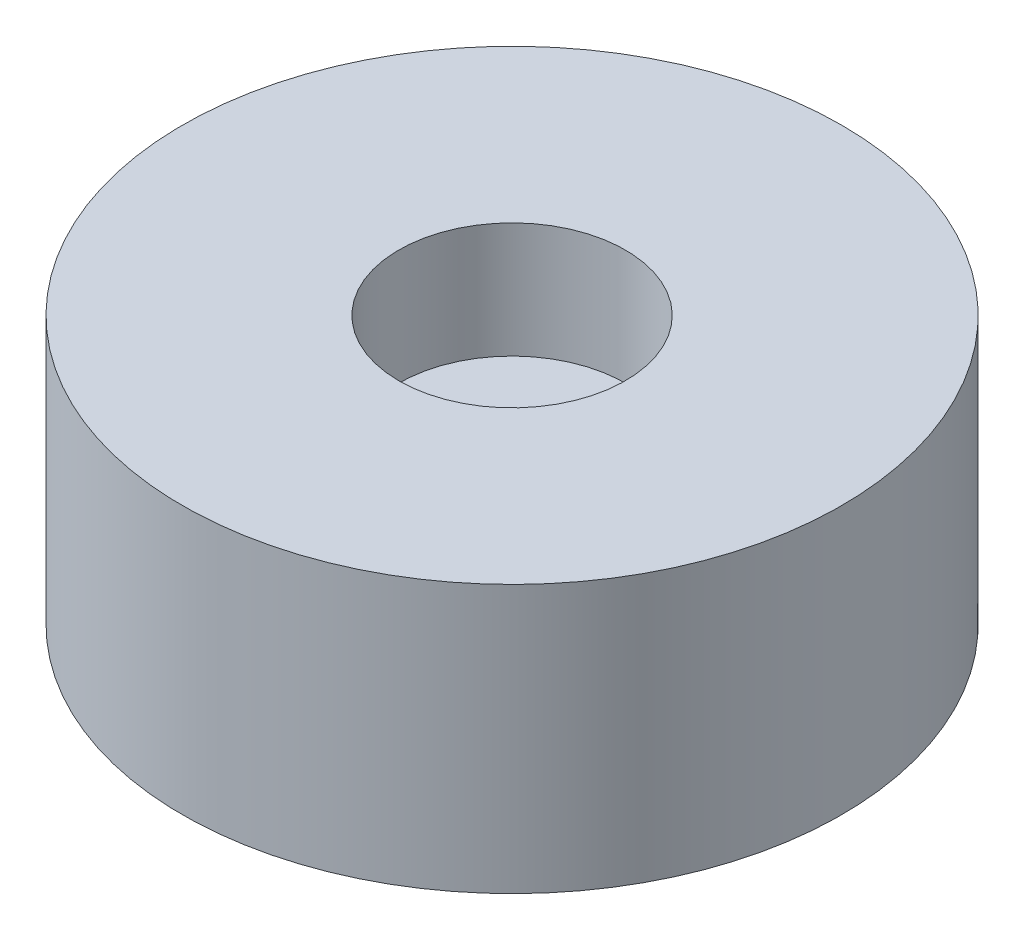
ISO-10303-21;
HEADER;
FILE_DESCRIPTION(('STEP AP214'),'2;1');
FILE_NAME('part.step','',(''),(''),'','','');
FILE_SCHEMA(('AUTOMOTIVE_DESIGN { 1 0 10303 214 1 1 1 1 }'));
ENDSEC;
DATA;
#1=APPLICATION_CONTEXT('core data for automotive mechanical design processes');
#2=APPLICATION_PROTOCOL_DEFINITION('international standard','automotive_design',2000,#1);
#3=PRODUCT_CONTEXT('',#1,'mechanical');
#4=PRODUCT('Part','Part','',(#3));
#5=PRODUCT_RELATED_PRODUCT_CATEGORY('part','',(#4));
#6=PRODUCT_DEFINITION_FORMATION('','',#4);
#7=PRODUCT_DEFINITION_CONTEXT('part definition',#1,'design');
#8=PRODUCT_DEFINITION('design','',#6,#7);
#9=PRODUCT_DEFINITION_SHAPE('','',#8);
#10=(LENGTH_UNIT() NAMED_UNIT(*) SI_UNIT(.MILLI.,.METRE.));
#11=(NAMED_UNIT(*) PLANE_ANGLE_UNIT() SI_UNIT($,.RADIAN.));
#12=(NAMED_UNIT(*) SI_UNIT($,.STERADIAN.) SOLID_ANGLE_UNIT());
#13=UNCERTAINTY_MEASURE_WITH_UNIT(LENGTH_MEASURE(1.E-05),#10,'distance_accuracy_value','');
#14=(GEOMETRIC_REPRESENTATION_CONTEXT(3) GLOBAL_UNCERTAINTY_ASSIGNED_CONTEXT((#13)) GLOBAL_UNIT_ASSIGNED_CONTEXT((#10,
#11,#12)) REPRESENTATION_CONTEXT('',''));
#15=CARTESIAN_POINT('',(0.,0.,0.));
#16=DIRECTION('',(0.,0.,1.));
#17=DIRECTION('',(1.,0.,0.));
#18=AXIS2_PLACEMENT_3D('',#15,#16,#17);
#19=CARTESIAN_POINT('',(0.,6.5,0.));
#20=DIRECTION('',(0.,-1.,0.));
#21=DIRECTION('',(0.,0.,-1.));
#22=AXIS2_PLACEMENT_3D('',#19,#20,#21);
#23=CYLINDRICAL_SURFACE('',#22,8.);
#24=CARTESIAN_POINT('',(0.,6.5,0.));
#25=DIRECTION('',(0.,1.,0.));
#26=DIRECTION('',(0.,0.,1.));
#27=AXIS2_PLACEMENT_3D('',#24,#25,#26);
#28=CIRCLE('',#27,8.);
#29=CARTESIAN_POINT('',(0.,6.5,-8.));
#30=VERTEX_POINT('',#29);
#31=EDGE_CURVE('E41',#30,#30,#28,.T.);
#32=CARTESIAN_POINT('',(0.,0.,0.));
#33=DIRECTION('',(0.,1.,0.));
#34=DIRECTION('',(0.,0.,1.));
#35=AXIS2_PLACEMENT_3D('',#32,#33,#34);
#36=CIRCLE('',#35,8.);
#37=CARTESIAN_POINT('',(0.,0.,-8.));
#38=VERTEX_POINT('',#37);
#39=EDGE_CURVE('E37',#38,#38,#36,.T.);
#40=CARTESIAN_POINT('',(0.,6.5,-8.));
#41=CARTESIAN_POINT('',(0.,6.43229166666667,-8.));
#42=CARTESIAN_POINT('',(0.,6.36458333333333,-8.));
#43=CARTESIAN_POINT('',(0.,6.22916666666667,-8.));
#44=CARTESIAN_POINT('',(0.,6.16145833333333,-8.));
#45=CARTESIAN_POINT('',(0.,6.02604166666667,-8.));
#46=CARTESIAN_POINT('',(0.,5.95833333333333,-8.));
#47=CARTESIAN_POINT('',(0.,5.82291666666667,-8.));
#48=CARTESIAN_POINT('',(0.,5.75520833333333,-8.));
#49=CARTESIAN_POINT('',(0.,5.61979166666667,-8.));
#50=CARTESIAN_POINT('',(0.,5.55208333333333,-8.));
#51=CARTESIAN_POINT('',(0.,5.41666666666667,-8.));
#52=CARTESIAN_POINT('',(0.,5.34895833333333,-8.));
#53=CARTESIAN_POINT('',(0.,5.21354166666667,-8.));
#54=CARTESIAN_POINT('',(0.,5.14583333333333,-8.));
#55=CARTESIAN_POINT('',(0.,5.01041666666667,-8.));
#56=CARTESIAN_POINT('',(0.,4.94270833333333,-8.));
#57=CARTESIAN_POINT('',(0.,4.80729166666667,-8.));
#58=CARTESIAN_POINT('',(0.,4.73958333333333,-8.));
#59=CARTESIAN_POINT('',(0.,4.60416666666667,-8.));
#60=CARTESIAN_POINT('',(0.,4.53645833333333,-8.));
#61=CARTESIAN_POINT('',(0.,4.40104166666667,-8.));
#62=CARTESIAN_POINT('',(0.,4.33333333333333,-8.));
#63=CARTESIAN_POINT('',(0.,4.19791666666667,-8.));
#64=CARTESIAN_POINT('',(0.,4.13020833333333,-8.));
#65=CARTESIAN_POINT('',(0.,3.99479166666667,-8.));
#66=CARTESIAN_POINT('',(0.,3.92708333333333,-8.));
#67=CARTESIAN_POINT('',(0.,3.79166666666667,-8.));
#68=CARTESIAN_POINT('',(0.,3.72395833333333,-8.));
#69=CARTESIAN_POINT('',(0.,3.58854166666667,-8.));
#70=CARTESIAN_POINT('',(0.,3.52083333333333,-8.));
#71=CARTESIAN_POINT('',(0.,3.38541666666667,-8.));
#72=CARTESIAN_POINT('',(0.,3.31770833333333,-8.));
#73=CARTESIAN_POINT('',(0.,3.18229166666667,-8.));
#74=CARTESIAN_POINT('',(0.,3.11458333333333,-8.));
#75=CARTESIAN_POINT('',(0.,2.97916666666667,-8.));
#76=CARTESIAN_POINT('',(0.,2.91145833333333,-8.));
#77=CARTESIAN_POINT('',(0.,2.77604166666667,-8.));
#78=CARTESIAN_POINT('',(0.,2.70833333333333,-8.));
#79=CARTESIAN_POINT('',(0.,2.57291666666667,-8.));
#80=CARTESIAN_POINT('',(0.,2.50520833333333,-8.));
#81=CARTESIAN_POINT('',(0.,2.36979166666667,-8.));
#82=CARTESIAN_POINT('',(0.,2.30208333333333,-8.));
#83=CARTESIAN_POINT('',(0.,2.16666666666667,-8.));
#84=CARTESIAN_POINT('',(0.,2.09895833333333,-8.));
#85=CARTESIAN_POINT('',(0.,1.96354166666667,-8.));
#86=CARTESIAN_POINT('',(0.,1.89583333333333,-8.));
#87=CARTESIAN_POINT('',(0.,1.76041666666667,-8.));
#88=CARTESIAN_POINT('',(0.,1.69270833333333,-8.));
#89=CARTESIAN_POINT('',(0.,1.55729166666667,-8.));
#90=CARTESIAN_POINT('',(0.,1.48958333333333,-8.));
#91=CARTESIAN_POINT('',(0.,1.35416666666667,-8.));
#92=CARTESIAN_POINT('',(0.,1.28645833333333,-8.));
#93=CARTESIAN_POINT('',(0.,1.15104166666667,-8.));
#94=CARTESIAN_POINT('',(0.,1.08333333333333,-8.));
#95=CARTESIAN_POINT('',(0.,0.947916666666667,-8.));
#96=CARTESIAN_POINT('',(0.,0.880208333333333,-8.));
#97=CARTESIAN_POINT('',(0.,0.744791666666667,-8.));
#98=CARTESIAN_POINT('',(0.,0.677083333333333,-8.));
#99=CARTESIAN_POINT('',(0.,0.541666666666667,-8.));
#100=CARTESIAN_POINT('',(0.,0.473958333333333,-8.));
#101=CARTESIAN_POINT('',(0.,0.338541666666667,-8.));
#102=CARTESIAN_POINT('',(0.,0.270833333333334,-8.));
#103=CARTESIAN_POINT('',(0.,0.135416666666667,-8.));
#104=CARTESIAN_POINT('',(0.,0.0677083333333334,-8.));
#105=CARTESIAN_POINT('',(0.,0.,-8.));
#106=B_SPLINE_CURVE_WITH_KNOTS('',3,(#40,#41,#42,#43,#44,#45,#46,#47,#48,#49,#50,#51,#52,#53,
#54,#55,#56,#57,#58,#59,#60,#61,#62,#63,#64,#65,#66,#67,#68,#69,#70,#71,#72,#73,#74,#75,#76,#77,
#78,#79,#80,#81,#82,#83,#84,#85,#86,#87,#88,#89,#90,#91,#92,#93,#94,#95,#96,#97,#98,#99,#100,
#101,#102,#103,#104,#105),.UNSPECIFIED.,.F.,.F.,(4,2,2,2,2,2,2,2,2,2,2,2,2,2,2,2,2,2,2,2,2,2,2,
2,2,2,2,2,2,2,2,2,4),(0.,0.203124999999999,0.40625,0.609375,0.812499999999999,1.015625,1.21875,
1.421875,1.625,1.828125,2.03125,2.234375,2.4375,2.640625,2.84375,3.046875,3.25,3.453125,3.65625,
3.859375,4.0625,4.265625,4.46875,4.671875,4.875,5.078125,5.28125,5.484375,5.6875,5.890625,
6.09375,6.296875,6.5),.UNSPECIFIED.);
#107=EDGE_CURVE('BSEAM34',#30,#38,#106,.T.);
#108=ORIENTED_EDGE('',*,*,#31,.F.);
#109=ORIENTED_EDGE('',*,*,#39,.T.);
#110=ORIENTED_EDGE('',*,*,#107,.T.);
#111=ORIENTED_EDGE('',*,*,#107,.F.);
#112=EDGE_LOOP('',(#108,#110,#109,#111));
#113=FACE_BOUND('',#112,.T.);
#114=ADVANCED_FACE('F34',(#113),#23,.T.);
#115=CARTESIAN_POINT('',(0.,6.5,0.));
#116=DIRECTION('',(0.,1.,0.));
#117=DIRECTION('',(0.,0.,1.));
#118=AXIS2_PLACEMENT_3D('',#115,#116,#117);
#119=PLANE('',#118);
#120=CARTESIAN_POINT('',(0.,6.5,0.));
#121=DIRECTION('',(0.,1.,0.));
#122=DIRECTION('',(0.,0.,1.));
#123=AXIS2_PLACEMENT_3D('',#120,#121,#122);
#124=CIRCLE('',#123,2.75);
#125=CARTESIAN_POINT('',(0.,6.5,2.75));
#126=VERTEX_POINT('',#125);
#127=EDGE_CURVE('E52',#126,#126,#124,.T.);
#128=ORIENTED_EDGE('',*,*,#127,.F.);
#129=EDGE_LOOP('',(#128));
#130=FACE_BOUND('',#129,.T.);
#131=ORIENTED_EDGE('',*,*,#31,.T.);
#132=EDGE_LOOP('',(#131));
#133=FACE_BOUND('',#132,.T.);
#134=ADVANCED_FACE('F74',(#130,#133),#119,.T.);
#135=CARTESIAN_POINT('',(0.,0.,0.));
#136=DIRECTION('',(0.,1.,0.));
#137=DIRECTION('',(0.,0.,1.));
#138=AXIS2_PLACEMENT_3D('',#135,#136,#137);
#139=PLANE('',#138);
#140=CARTESIAN_POINT('',(0.,0.,0.));
#141=DIRECTION('',(0.,-1.,0.));
#142=DIRECTION('',(0.,0.,-1.));
#143=AXIS2_PLACEMENT_3D('',#140,#141,#142);
#144=CIRCLE('',#143,1.5);
#145=CARTESIAN_POINT('',(0.,0.,-1.5));
#146=VERTEX_POINT('',#145);
#147=EDGE_CURVE('E10',#146,#146,#144,.T.);
#148=ORIENTED_EDGE('',*,*,#147,.F.);
#149=EDGE_LOOP('',(#148));
#150=FACE_BOUND('',#149,.T.);
#151=ORIENTED_EDGE('',*,*,#39,.F.);
#152=EDGE_LOOP('',(#151));
#153=FACE_BOUND('',#152,.T.);
#154=ADVANCED_FACE('F79',(#150,#153),#139,.F.);
#155=CARTESIAN_POINT('',(0.,3.7,0.));
#156=DIRECTION('',(0.,1.,0.));
#157=DIRECTION('',(0.,0.,1.));
#158=AXIS2_PLACEMENT_3D('',#155,#156,#157);
#159=CYLINDRICAL_SURFACE('',#158,2.75);
#160=CARTESIAN_POINT('',(0.,3.7,0.));
#161=DIRECTION('',(0.,1.,0.));
#162=DIRECTION('',(0.,0.,1.));
#163=AXIS2_PLACEMENT_3D('',#160,#161,#162);
#164=CIRCLE('',#163,2.75);
#165=CARTESIAN_POINT('',(0.,3.7,2.75));
#166=VERTEX_POINT('',#165);
#167=EDGE_CURVE('E49',#166,#166,#164,.T.);
#168=ORIENTED_EDGE('',*,*,#167,.F.);
#169=EDGE_LOOP('',(#168));
#170=FACE_BOUND('',#169,.T.);
#171=ORIENTED_EDGE('',*,*,#127,.T.);
#172=EDGE_LOOP('',(#171));
#173=FACE_BOUND('',#172,.T.);
#174=ADVANCED_FACE('F70',(#170,#173),#159,.F.);
#175=CARTESIAN_POINT('',(0.,3.7,0.));
#176=DIRECTION('',(0.,1.,0.));
#177=DIRECTION('',(0.,0.,1.));
#178=AXIS2_PLACEMENT_3D('',#175,#176,#177);
#179=PLANE('',#178);
#180=ORIENTED_EDGE('',*,*,#167,.T.);
#181=EDGE_LOOP('',(#180));
#182=FACE_BOUND('',#181,.T.);
#183=ADVANCED_FACE('F63',(#182),#179,.T.);
#184=CARTESIAN_POINT('',(0.,-2.,0.));
#185=DIRECTION('',(0.,1.,0.));
#186=DIRECTION('',(0.,0.,1.));
#187=AXIS2_PLACEMENT_3D('',#184,#185,#186);
#188=CYLINDRICAL_SURFACE('',#187,1.5);
#189=CARTESIAN_POINT('',(0.,-2.,0.));
#190=DIRECTION('',(0.,-1.,0.));
#191=DIRECTION('',(0.,0.,-1.));
#192=AXIS2_PLACEMENT_3D('',#189,#190,#191);
#193=CIRCLE('',#192,1.5);
#194=CARTESIAN_POINT('',(0.,-2.,-1.5));
#195=VERTEX_POINT('',#194);
#196=EDGE_CURVE('E48',#195,#195,#193,.T.);
#197=ORIENTED_EDGE('',*,*,#196,.F.);
#198=EDGE_LOOP('',(#197));
#199=FACE_BOUND('',#198,.T.);
#200=ORIENTED_EDGE('',*,*,#147,.T.);
#201=EDGE_LOOP('',(#200));
#202=FACE_BOUND('',#201,.T.);
#203=ADVANCED_FACE('F61',(#199,#202),#188,.T.);
#204=CARTESIAN_POINT('',(0.,-2.,0.));
#205=DIRECTION('',(0.,-1.,0.));
#206=DIRECTION('',(0.,0.,-1.));
#207=AXIS2_PLACEMENT_3D('',#204,#205,#206);
#208=PLANE('',#207);
#209=ORIENTED_EDGE('',*,*,#196,.T.);
#210=EDGE_LOOP('',(#209));
#211=FACE_BOUND('',#210,.T.);
#212=ADVANCED_FACE('F59',(#211),#208,.T.);
#213=CLOSED_SHELL('',(#114,#134,#154,#174,#183,#203,#212));
#214=MANIFOLD_SOLID_BREP('B2',#213);
#215=ADVANCED_BREP_SHAPE_REPRESENTATION('',(#18,#214),#14);
#216=SHAPE_DEFINITION_REPRESENTATION(#9,#215);
ENDSEC;
END-ISO-10303-21;
